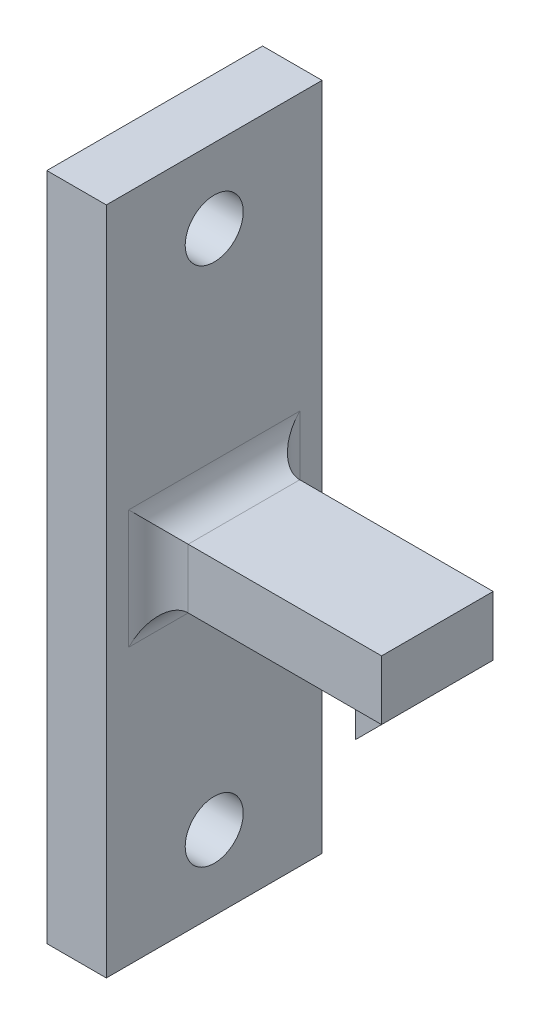
ISO-10303-21;
HEADER;
FILE_DESCRIPTION(('STEP AP214'),'2;1');
FILE_NAME('part.step','',(''),(''),'','','');
FILE_SCHEMA(('AUTOMOTIVE_DESIGN { 1 0 10303 214 1 1 1 1 }'));
ENDSEC;
DATA;
#1=APPLICATION_CONTEXT('core data for automotive mechanical design processes');
#2=APPLICATION_PROTOCOL_DEFINITION('international standard','automotive_design',2000,#1);
#3=PRODUCT_CONTEXT('',#1,'mechanical');
#4=PRODUCT('Part','Part','',(#3));
#5=PRODUCT_RELATED_PRODUCT_CATEGORY('part','',(#4));
#6=PRODUCT_DEFINITION_FORMATION('','',#4);
#7=PRODUCT_DEFINITION_CONTEXT('part definition',#1,'design');
#8=PRODUCT_DEFINITION('design','',#6,#7);
#9=PRODUCT_DEFINITION_SHAPE('','',#8);
#10=(LENGTH_UNIT() NAMED_UNIT(*) SI_UNIT(.MILLI.,.METRE.));
#11=(NAMED_UNIT(*) PLANE_ANGLE_UNIT() SI_UNIT($,.RADIAN.));
#12=(NAMED_UNIT(*) SI_UNIT($,.STERADIAN.) SOLID_ANGLE_UNIT());
#13=UNCERTAINTY_MEASURE_WITH_UNIT(LENGTH_MEASURE(1.E-05),#10,'distance_accuracy_value','');
#14=(GEOMETRIC_REPRESENTATION_CONTEXT(3) GLOBAL_UNCERTAINTY_ASSIGNED_CONTEXT((#13)) GLOBAL_UNIT_ASSIGNED_CONTEXT((#10,
#11,#12)) REPRESENTATION_CONTEXT('',''));
#15=CARTESIAN_POINT('',(0.,0.,0.));
#16=DIRECTION('',(0.,0.,1.));
#17=DIRECTION('',(1.,0.,0.));
#18=AXIS2_PLACEMENT_3D('',#15,#16,#17);
#19=CARTESIAN_POINT('',(0.,-1.99999999999996,-3.49999999999987));
#20=DIRECTION('',(0.,-1.,0.));
#21=DIRECTION('',(1.,0.,0.));
#22=AXIS2_PLACEMENT_3D('',#19,#20,#21);
#23=PLANE('',#22);
#24=DIRECTION('',(1.,0.,0.));
#25=VECTOR('',#24,1.);
#26=CARTESIAN_POINT('',(240.024077489567,-2.,1.25000000000013));
#27=LINE('',#26,#25);
#28=CARTESIAN_POINT('',(227.024077489567,-2.,1.25000000000013));
#29=VERTEX_POINT('',#28);
#30=CARTESIAN_POINT('',(240.024077489567,-2.,1.25000000000013));
#31=VERTEX_POINT('',#30);
#32=EDGE_CURVE('E211',#29,#31,#27,.T.);
#33=ORIENTED_EDGE('',*,*,#32,.F.);
#34=DIRECTION('',(0.,0.,1.));
#35=VECTOR('',#34,1.);
#36=CARTESIAN_POINT('',(227.024077489567,-2.,-6.24999999999987));
#37=LINE('',#36,#35);
#38=CARTESIAN_POINT('',(227.024077489567,-2.,-6.24999999999987));
#39=VERTEX_POINT('',#38);
#40=EDGE_CURVE('E257',#29,#39,#37,.F.);
#41=ORIENTED_EDGE('',*,*,#40,.T.);
#42=DIRECTION('',(-1.,0.,0.));
#43=VECTOR('',#42,1.);
#44=CARTESIAN_POINT('',(240.024077489567,-2.,-6.24999999999987));
#45=LINE('',#44,#43);
#46=CARTESIAN_POINT('',(240.024077489567,-2.,-6.24999999999987));
#47=VERTEX_POINT('',#46);
#48=EDGE_CURVE('E222',#47,#39,#45,.T.);
#49=ORIENTED_EDGE('',*,*,#48,.F.);
#50=DIRECTION('',(0.,0.,1.));
#51=VECTOR('',#50,1.);
#52=CARTESIAN_POINT('',(240.024077489567,-2.,-6.24999999999987));
#53=LINE('',#52,#51);
#54=CARTESIAN_POINT('',(240.024077489567,-2.,-3.99999999999988));
#55=VERTEX_POINT('',#54);
#56=EDGE_CURVE('E228',#47,#55,#53,.T.);
#57=ORIENTED_EDGE('',*,*,#56,.T.);
#58=DIRECTION('',(1.,0.,0.));
#59=VECTOR('',#58,1.);
#60=CARTESIAN_POINT('',(236.024077489567,-2.,-3.99999999999988));
#61=LINE('',#60,#59);
#62=CARTESIAN_POINT('',(236.024077489567,-2.,-3.99999999999988));
#63=VERTEX_POINT('',#62);
#64=EDGE_CURVE('E192',#63,#55,#61,.T.);
#65=ORIENTED_EDGE('',*,*,#64,.F.);
#66=DIRECTION('',(0.,0.,1.));
#67=VECTOR('',#66,1.);
#68=CARTESIAN_POINT('',(236.024077489567,-2.,-3.49999999999987));
#69=LINE('',#68,#67);
#70=CARTESIAN_POINT('',(236.024077489567,-2.,-0.999999999999875));
#71=VERTEX_POINT('',#70);
#72=EDGE_CURVE('E238',#63,#71,#69,.T.);
#73=ORIENTED_EDGE('',*,*,#72,.T.);
#74=DIRECTION('',(-1.,0.,0.));
#75=VECTOR('',#74,1.);
#76=CARTESIAN_POINT('',(240.024077489567,-2.,-0.999999999999875));
#77=LINE('',#76,#75);
#78=CARTESIAN_POINT('',(240.024077489567,-2.,-0.999999999999875));
#79=VERTEX_POINT('',#78);
#80=EDGE_CURVE('E174',#79,#71,#77,.T.);
#81=ORIENTED_EDGE('',*,*,#80,.F.);
#82=DIRECTION('',(0.,0.,-1.));
#83=VECTOR('',#82,1.);
#84=CARTESIAN_POINT('',(240.024077489567,-2.,1.25000000000013));
#85=LINE('',#84,#83);
#86=EDGE_CURVE('E214',#31,#79,#85,.T.);
#87=ORIENTED_EDGE('',*,*,#86,.F.);
#88=EDGE_LOOP('',(#33,#41,#49,#57,#65,#73,#81,#87));
#89=FACE_BOUND('',#88,.T.);
#90=ADVANCED_FACE('F49',(#89),#23,.T.);
#91=CARTESIAN_POINT('',(0.,1.99999999999996,-3.49999999999987));
#92=DIRECTION('',(0.,1.,0.));
#93=DIRECTION('',(-1.,0.,0.));
#94=AXIS2_PLACEMENT_3D('',#91,#92,#93);
#95=PLANE('',#94);
#96=DIRECTION('',(1.,0.,0.));
#97=VECTOR('',#96,1.);
#98=CARTESIAN_POINT('',(240.024077489567,1.99999999999986,-6.24999999999987));
#99=LINE('',#98,#97);
#100=CARTESIAN_POINT('',(227.024077489567,1.99999999999992,-6.24999999999987));
#101=VERTEX_POINT('',#100);
#102=CARTESIAN_POINT('',(240.024077489567,1.99999999999986,-6.24999999999987));
#103=VERTEX_POINT('',#102);
#104=EDGE_CURVE('E225',#101,#103,#99,.T.);
#105=ORIENTED_EDGE('',*,*,#104,.F.);
#106=DIRECTION('',(0.,0.,-1.));
#107=VECTOR('',#106,1.);
#108=CARTESIAN_POINT('',(227.024077489567,2.,1.25000000000013));
#109=LINE('',#108,#107);
#110=CARTESIAN_POINT('',(227.024077489567,2.,1.25000000000013));
#111=VERTEX_POINT('',#110);
#112=EDGE_CURVE('E59',#101,#111,#109,.F.);
#113=ORIENTED_EDGE('',*,*,#112,.T.);
#114=DIRECTION('',(-1.,0.,0.));
#115=VECTOR('',#114,1.);
#116=CARTESIAN_POINT('',(240.024077489567,2.,1.25000000000013));
#117=LINE('',#116,#115);
#118=CARTESIAN_POINT('',(240.024077489567,2.,1.25000000000013));
#119=VERTEX_POINT('',#118);
#120=EDGE_CURVE('E208',#119,#111,#117,.T.);
#121=ORIENTED_EDGE('',*,*,#120,.F.);
#122=DIRECTION('',(0.,0.,1.));
#123=VECTOR('',#122,1.);
#124=CARTESIAN_POINT('',(240.024077489567,2.,-3.49999999999987));
#125=LINE('',#124,#123);
#126=EDGE_CURVE('E241',#103,#119,#125,.T.);
#127=ORIENTED_EDGE('',*,*,#126,.F.);
#128=EDGE_LOOP('',(#105,#113,#121,#127));
#129=FACE_BOUND('',#128,.T.);
#130=ADVANCED_FACE('F333',(#129),#95,.T.);
#131=CARTESIAN_POINT('',(240.024077489567,2.,-3.49999999999987));
#132=DIRECTION('',(1.,0.,0.));
#133=DIRECTION('',(0.,0.,-1.));
#134=AXIS2_PLACEMENT_3D('',#131,#132,#133);
#135=PLANE('',#134);
#136=DIRECTION('',(0.,0.,-1.));
#137=VECTOR('',#136,1.);
#138=CARTESIAN_POINT('',(240.024077489567,-2.,-1.49999999999987));
#139=LINE('',#138,#137);
#140=EDGE_CURVE('E232',#79,#55,#139,.T.);
#141=ORIENTED_EDGE('',*,*,#140,.T.);
#142=ORIENTED_EDGE('',*,*,#56,.F.);
#143=DIRECTION('',(0.,-1.,0.));
#144=VECTOR('',#143,1.);
#145=CARTESIAN_POINT('',(240.024077489567,-2.,-6.24999999999987));
#146=LINE('',#145,#144);
#147=EDGE_CURVE('E218',#103,#47,#146,.T.);
#148=ORIENTED_EDGE('',*,*,#147,.F.);
#149=ORIENTED_EDGE('',*,*,#126,.T.);
#150=DIRECTION('',(0.,1.,0.));
#151=VECTOR('',#150,1.);
#152=CARTESIAN_POINT('',(240.024077489567,2.,1.25000000000013));
#153=LINE('',#152,#151);
#154=EDGE_CURVE('E204',#31,#119,#153,.T.);
#155=ORIENTED_EDGE('',*,*,#154,.F.);
#156=ORIENTED_EDGE('',*,*,#86,.T.);
#157=EDGE_LOOP('',(#141,#142,#148,#149,#155,#156));
#158=FACE_BOUND('',#157,.T.);
#159=ADVANCED_FACE('F340',(#158),#135,.T.);
#160=CARTESIAN_POINT('',(236.024077489567,2.,-1.49999999999987));
#161=DIRECTION('',(1.,0.,0.));
#162=DIRECTION('',(0.,0.,-1.));
#163=AXIS2_PLACEMENT_3D('',#160,#161,#162);
#164=PLANE('',#163);
#165=ORIENTED_EDGE('',*,*,#72,.F.);
#166=DIRECTION('',(0.,1.,0.));
#167=VECTOR('',#166,1.);
#168=CARTESIAN_POINT('',(236.024077489567,-6.,-3.99999999999988));
#169=LINE('',#168,#167);
#170=CARTESIAN_POINT('',(236.024077489567,-6.,-3.99999999999988));
#171=VERTEX_POINT('',#170);
#172=EDGE_CURVE('E200',#171,#63,#169,.T.);
#173=ORIENTED_EDGE('',*,*,#172,.F.);
#174=DIRECTION('',(0.,0.,-1.));
#175=VECTOR('',#174,1.);
#176=CARTESIAN_POINT('',(236.024077489567,-6.,-1.49999999999987));
#177=LINE('',#176,#175);
#178=CARTESIAN_POINT('',(236.024077489567,-6.,-0.999999999999875));
#179=VERTEX_POINT('',#178);
#180=EDGE_CURVE('E235',#179,#171,#177,.T.);
#181=ORIENTED_EDGE('',*,*,#180,.F.);
#182=DIRECTION('',(0.,-1.,0.));
#183=VECTOR('',#182,1.);
#184=CARTESIAN_POINT('',(236.024077489567,-2.,-0.999999999999875));
#185=LINE('',#184,#183);
#186=EDGE_CURVE('E179',#71,#179,#185,.T.);
#187=ORIENTED_EDGE('',*,*,#186,.F.);
#188=EDGE_LOOP('',(#165,#173,#181,#187));
#189=FACE_BOUND('',#188,.T.);
#190=ADVANCED_FACE('F509',(#189),#164,.F.);
#191=CARTESIAN_POINT('',(240.024077489567,-2.,-1.49999999999987));
#192=DIRECTION('',(-0.707106781186547,0.707106781186548,0.));
#193=DIRECTION('',(-0.707106781186548,-0.707106781186547,0.));
#194=AXIS2_PLACEMENT_3D('',#191,#192,#193);
#195=PLANE('',#194);
#196=ORIENTED_EDGE('',*,*,#180,.T.);
#197=DIRECTION('',(-0.707106781186548,-0.707106781186547,0.));
#198=VECTOR('',#197,1.);
#199=CARTESIAN_POINT('',(240.024077489567,-2.,-3.99999999999988));
#200=LINE('',#199,#198);
#201=EDGE_CURVE('E196',#55,#171,#200,.T.);
#202=ORIENTED_EDGE('',*,*,#201,.F.);
#203=ORIENTED_EDGE('',*,*,#140,.F.);
#204=DIRECTION('',(0.707106781186547,0.707106781186548,0.));
#205=VECTOR('',#204,1.);
#206=CARTESIAN_POINT('',(236.024077489567,-6.,-0.999999999999875));
#207=LINE('',#206,#205);
#208=EDGE_CURVE('E188',#179,#79,#207,.T.);
#209=ORIENTED_EDGE('',*,*,#208,.F.);
#210=EDGE_LOOP('',(#196,#202,#203,#209));
#211=FACE_BOUND('',#210,.T.);
#212=ADVANCED_FACE('F499',(#211),#195,.F.);
#213=CARTESIAN_POINT('',(0.,0.,-6.24999999999987));
#214=DIRECTION('',(0.,0.,1.));
#215=DIRECTION('',(1.,0.,0.));
#216=AXIS2_PLACEMENT_3D('',#213,#214,#215);
#217=PLANE('',#216);
#218=ORIENTED_EDGE('',*,*,#48,.T.);
#219=DIRECTION('',(0.,1.,0.));
#220=VECTOR('',#219,1.);
#221=CARTESIAN_POINT('',(227.024077489567,0.,-6.24999999999987));
#222=LINE('',#221,#220);
#223=EDGE_CURVE('E11',#39,#101,#222,.T.);
#224=ORIENTED_EDGE('',*,*,#223,.T.);
#225=ORIENTED_EDGE('',*,*,#104,.T.);
#226=ORIENTED_EDGE('',*,*,#147,.T.);
#227=EDGE_LOOP('',(#218,#224,#225,#226));
#228=FACE_BOUND('',#227,.T.);
#229=ADVANCED_FACE('F489',(#228),#217,.F.);
#230=CARTESIAN_POINT('',(0.,0.,1.25000000000013));
#231=DIRECTION('',(0.,0.,-1.));
#232=DIRECTION('',(-1.,0.,0.));
#233=AXIS2_PLACEMENT_3D('',#230,#231,#232);
#234=PLANE('',#233);
#235=ORIENTED_EDGE('',*,*,#120,.T.);
#236=DIRECTION('',(0.,-1.,0.));
#237=VECTOR('',#236,1.);
#238=CARTESIAN_POINT('',(227.024077489567,0.,1.25000000000013));
#239=LINE('',#238,#237);
#240=EDGE_CURVE('E261',#111,#29,#239,.T.);
#241=ORIENTED_EDGE('',*,*,#240,.T.);
#242=ORIENTED_EDGE('',*,*,#32,.T.);
#243=ORIENTED_EDGE('',*,*,#154,.T.);
#244=EDGE_LOOP('',(#235,#241,#242,#243));
#245=FACE_BOUND('',#244,.T.);
#246=ADVANCED_FACE('F367',(#245),#234,.F.);
#247=CARTESIAN_POINT('',(0.,0.,-3.99999999999988));
#248=DIRECTION('',(0.,0.,1.));
#249=DIRECTION('',(1.,0.,0.));
#250=AXIS2_PLACEMENT_3D('',#247,#248,#249);
#251=PLANE('',#250);
#252=ORIENTED_EDGE('',*,*,#64,.T.);
#253=ORIENTED_EDGE('',*,*,#201,.T.);
#254=ORIENTED_EDGE('',*,*,#172,.T.);
#255=EDGE_LOOP('',(#252,#253,#254));
#256=FACE_BOUND('',#255,.T.);
#257=ADVANCED_FACE('F464',(#256),#251,.F.);
#258=CARTESIAN_POINT('',(0.,0.,-0.999999999999875));
#259=DIRECTION('',(0.,0.,1.));
#260=DIRECTION('',(1.,0.,0.));
#261=AXIS2_PLACEMENT_3D('',#258,#259,#260);
#262=PLANE('',#261);
#263=ORIENTED_EDGE('',*,*,#80,.T.);
#264=ORIENTED_EDGE('',*,*,#186,.T.);
#265=ORIENTED_EDGE('',*,*,#208,.T.);
#266=EDGE_LOOP('',(#263,#264,#265));
#267=FACE_BOUND('',#266,.T.);
#268=ADVANCED_FACE('F456',(#267),#262,.T.);
#269=CARTESIAN_POINT('',(221.024077489567,-22.5,4.75000000000012));
#270=DIRECTION('',(0.,0.,-1.));
#271=DIRECTION('',(-1.,0.,0.));
#272=AXIS2_PLACEMENT_3D('',#269,#270,#271);
#273=PLANE('',#272);
#274=DIRECTION('',(0.,1.,0.));
#275=VECTOR('',#274,1.);
#276=CARTESIAN_POINT('',(225.024077489567,-22.5,4.75000000000012));
#277=LINE('',#276,#275);
#278=CARTESIAN_POINT('',(225.024077489567,-22.5,4.75000000000012));
#279=VERTEX_POINT('',#278);
#280=CARTESIAN_POINT('',(225.024077489567,22.5,4.75000000000012));
#281=VERTEX_POINT('',#280);
#282=EDGE_CURVE('E172',#279,#281,#277,.T.);
#283=ORIENTED_EDGE('',*,*,#282,.T.);
#284=DIRECTION('',(1.,0.,0.));
#285=VECTOR('',#284,1.);
#286=CARTESIAN_POINT('',(221.024077489567,22.5,4.75000000000012));
#287=LINE('',#286,#285);
#288=CARTESIAN_POINT('',(221.024077489567,22.5,4.75000000000012));
#289=VERTEX_POINT('',#288);
#290=EDGE_CURVE('E150',#289,#281,#287,.T.);
#291=ORIENTED_EDGE('',*,*,#290,.F.);
#292=DIRECTION('',(0.,1.,0.));
#293=VECTOR('',#292,1.);
#294=CARTESIAN_POINT('',(221.024077489567,-22.5,4.75000000000012));
#295=LINE('',#294,#293);
#296=CARTESIAN_POINT('',(221.024077489567,-22.5,4.75000000000012));
#297=VERTEX_POINT('',#296);
#298=EDGE_CURVE('E158',#297,#289,#295,.T.);
#299=ORIENTED_EDGE('',*,*,#298,.F.);
#300=DIRECTION('',(1.,0.,0.));
#301=VECTOR('',#300,1.);
#302=CARTESIAN_POINT('',(221.024077489567,-22.5,4.75000000000012));
#303=LINE('',#302,#301);
#304=EDGE_CURVE('E300',#297,#279,#303,.T.);
#305=ORIENTED_EDGE('',*,*,#304,.T.);
#306=EDGE_LOOP('',(#283,#291,#299,#305));
#307=FACE_BOUND('',#306,.T.);
#308=ADVANCED_FACE('F170',(#307),#273,.F.);
#309=CARTESIAN_POINT('',(221.024077489567,22.5,-9.74999999999988));
#310=DIRECTION('',(0.,-1.,0.));
#311=DIRECTION('',(0.,0.,-1.));
#312=AXIS2_PLACEMENT_3D('',#309,#310,#311);
#313=PLANE('',#312);
#314=DIRECTION('',(0.,0.,-1.));
#315=VECTOR('',#314,1.);
#316=CARTESIAN_POINT('',(225.024077489567,22.5,-9.74999999999988));
#317=LINE('',#316,#315);
#318=CARTESIAN_POINT('',(225.024077489567,22.5,-9.74999999999988));
#319=VERTEX_POINT('',#318);
#320=EDGE_CURVE('E303',#281,#319,#317,.T.);
#321=ORIENTED_EDGE('',*,*,#320,.T.);
#322=DIRECTION('',(1.,0.,0.));
#323=VECTOR('',#322,1.);
#324=CARTESIAN_POINT('',(221.024077489567,22.5,-9.74999999999988));
#325=LINE('',#324,#323);
#326=CARTESIAN_POINT('',(221.024077489567,22.5,-9.74999999999988));
#327=VERTEX_POINT('',#326);
#328=EDGE_CURVE('E153',#327,#319,#325,.T.);
#329=ORIENTED_EDGE('',*,*,#328,.F.);
#330=DIRECTION('',(0.,0.,-1.));
#331=VECTOR('',#330,1.);
#332=CARTESIAN_POINT('',(221.024077489567,22.5,-9.74999999999988));
#333=LINE('',#332,#331);
#334=EDGE_CURVE('E146',#289,#327,#333,.T.);
#335=ORIENTED_EDGE('',*,*,#334,.F.);
#336=ORIENTED_EDGE('',*,*,#290,.T.);
#337=EDGE_LOOP('',(#321,#329,#335,#336));
#338=FACE_BOUND('',#337,.T.);
#339=ADVANCED_FACE('F148',(#338),#313,.F.);
#340=CARTESIAN_POINT('',(221.024077489567,-22.5,-9.74999999999988));
#341=DIRECTION('',(0.,0.,1.));
#342=DIRECTION('',(1.,0.,0.));
#343=AXIS2_PLACEMENT_3D('',#340,#341,#342);
#344=PLANE('',#343);
#345=DIRECTION('',(0.,-1.,0.));
#346=VECTOR('',#345,1.);
#347=CARTESIAN_POINT('',(225.024077489567,-22.5,-9.74999999999988));
#348=LINE('',#347,#346);
#349=CARTESIAN_POINT('',(225.024077489567,-22.5,-9.74999999999988));
#350=VERTEX_POINT('',#349);
#351=EDGE_CURVE('E307',#319,#350,#348,.T.);
#352=ORIENTED_EDGE('',*,*,#351,.T.);
#353=DIRECTION('',(1.,0.,0.));
#354=VECTOR('',#353,1.);
#355=CARTESIAN_POINT('',(221.024077489567,-22.5,-9.74999999999988));
#356=LINE('',#355,#354);
#357=CARTESIAN_POINT('',(221.024077489567,-22.5,-9.74999999999988));
#358=VERTEX_POINT('',#357);
#359=EDGE_CURVE('E181',#358,#350,#356,.T.);
#360=ORIENTED_EDGE('',*,*,#359,.F.);
#361=DIRECTION('',(0.,-1.,0.));
#362=VECTOR('',#361,1.);
#363=CARTESIAN_POINT('',(221.024077489567,-22.5,-9.74999999999988));
#364=LINE('',#363,#362);
#365=EDGE_CURVE('E157',#327,#358,#364,.T.);
#366=ORIENTED_EDGE('',*,*,#365,.F.);
#367=ORIENTED_EDGE('',*,*,#328,.T.);
#368=EDGE_LOOP('',(#352,#360,#366,#367));
#369=FACE_BOUND('',#368,.T.);
#370=ADVANCED_FACE('F323',(#369),#344,.F.);
#371=CARTESIAN_POINT('',(221.024077489567,-22.5,-9.74999999999988));
#372=DIRECTION('',(0.,1.,0.));
#373=DIRECTION('',(0.,0.,1.));
#374=AXIS2_PLACEMENT_3D('',#371,#372,#373);
#375=PLANE('',#374);
#376=DIRECTION('',(0.,0.,1.));
#377=VECTOR('',#376,1.);
#378=CARTESIAN_POINT('',(225.024077489567,-22.5,-9.74999999999988));
#379=LINE('',#378,#377);
#380=EDGE_CURVE('E168',#350,#279,#379,.T.);
#381=ORIENTED_EDGE('',*,*,#380,.T.);
#382=ORIENTED_EDGE('',*,*,#304,.F.);
#383=DIRECTION('',(0.,0.,1.));
#384=VECTOR('',#383,1.);
#385=CARTESIAN_POINT('',(221.024077489567,-22.5,-9.74999999999988));
#386=LINE('',#385,#384);
#387=EDGE_CURVE('E163',#358,#297,#386,.T.);
#388=ORIENTED_EDGE('',*,*,#387,.F.);
#389=ORIENTED_EDGE('',*,*,#359,.T.);
#390=EDGE_LOOP('',(#381,#382,#388,#389));
#391=FACE_BOUND('',#390,.T.);
#392=ADVANCED_FACE('F318',(#391),#375,.F.);
#393=CARTESIAN_POINT('',(221.024077489567,0.,0.));
#394=DIRECTION('',(1.,0.,0.));
#395=DIRECTION('',(0.,0.,-1.));
#396=AXIS2_PLACEMENT_3D('',#393,#394,#395);
#397=PLANE('',#396);
#398=CARTESIAN_POINT('',(221.024077489567,17.5,-2.49999999999987));
#399=DIRECTION('',(-1.,0.,0.));
#400=DIRECTION('',(0.,0.,1.));
#401=AXIS2_PLACEMENT_3D('',#398,#399,#400);
#402=CIRCLE('',#401,1.95);
#403=CARTESIAN_POINT('',(221.024077489567,17.5,-0.549999999999875));
#404=VERTEX_POINT('',#403);
#405=EDGE_CURVE('E292',#404,#404,#402,.T.);
#406=ORIENTED_EDGE('',*,*,#405,.F.);
#407=EDGE_LOOP('',(#406));
#408=FACE_BOUND('',#407,.T.);
#409=CARTESIAN_POINT('',(221.024077489567,-17.5,-2.49999999999987));
#410=DIRECTION('',(-1.,0.,0.));
#411=DIRECTION('',(0.,0.,1.));
#412=AXIS2_PLACEMENT_3D('',#409,#410,#411);
#413=CIRCLE('',#412,1.95);
#414=CARTESIAN_POINT('',(221.024077489567,-17.5,-0.549999999999875));
#415=VERTEX_POINT('',#414);
#416=EDGE_CURVE('E286',#415,#415,#413,.T.);
#417=ORIENTED_EDGE('',*,*,#416,.F.);
#418=EDGE_LOOP('',(#417));
#419=FACE_BOUND('',#418,.T.);
#420=ORIENTED_EDGE('',*,*,#298,.T.);
#421=ORIENTED_EDGE('',*,*,#334,.T.);
#422=ORIENTED_EDGE('',*,*,#365,.T.);
#423=ORIENTED_EDGE('',*,*,#387,.T.);
#424=EDGE_LOOP('',(#420,#421,#422,#423));
#425=FACE_BOUND('',#424,.T.);
#426=ADVANCED_FACE('F161',(#408,#419,#425),#397,.F.);
#427=CARTESIAN_POINT('',(225.024077489567,0.,0.));
#428=DIRECTION('',(1.,0.,0.));
#429=DIRECTION('',(0.,0.,-1.));
#430=AXIS2_PLACEMENT_3D('',#427,#428,#429);
#431=PLANE('',#430);
#432=DIRECTION('',(0.,1.,0.));
#433=VECTOR('',#432,1.);
#434=CARTESIAN_POINT('',(225.024077489567,0.,-8.24999999999988));
#435=LINE('',#434,#433);
#436=CARTESIAN_POINT('',(225.024077489567,4.,-8.24999999999988));
#437=VERTEX_POINT('',#436);
#438=CARTESIAN_POINT('',(225.024077489567,-4.,-8.24999999999988));
#439=VERTEX_POINT('',#438);
#440=EDGE_CURVE('E244',#437,#439,#435,.F.);
#441=ORIENTED_EDGE('',*,*,#440,.T.);
#442=DIRECTION('',(0.,0.,1.));
#443=VECTOR('',#442,1.);
#444=CARTESIAN_POINT('',(225.024077489567,-4.,1.25000000000013));
#445=LINE('',#444,#443);
#446=CARTESIAN_POINT('',(225.024077489567,-4.,3.25000000000013));
#447=VERTEX_POINT('',#446);
#448=EDGE_CURVE('E253',#439,#447,#445,.T.);
#449=ORIENTED_EDGE('',*,*,#448,.T.);
#450=DIRECTION('',(0.,-1.,0.));
#451=VECTOR('',#450,1.);
#452=CARTESIAN_POINT('',(225.024077489567,0.,3.25000000000013));
#453=LINE('',#452,#451);
#454=CARTESIAN_POINT('',(225.024077489567,4.,3.25000000000013));
#455=VERTEX_POINT('',#454);
#456=EDGE_CURVE('E250',#447,#455,#453,.F.);
#457=ORIENTED_EDGE('',*,*,#456,.T.);
#458=DIRECTION('',(0.,0.,-1.));
#459=VECTOR('',#458,1.);
#460=CARTESIAN_POINT('',(225.024077489567,4.,-6.24999999999987));
#461=LINE('',#460,#459);
#462=EDGE_CURVE('E247',#455,#437,#461,.T.);
#463=ORIENTED_EDGE('',*,*,#462,.T.);
#464=EDGE_LOOP('',(#441,#449,#457,#463));
#465=FACE_BOUND('',#464,.T.);
#466=CARTESIAN_POINT('',(225.024077489567,17.5,-2.49999999999987));
#467=DIRECTION('',(-1.,0.,0.));
#468=DIRECTION('',(0.,0.,1.));
#469=AXIS2_PLACEMENT_3D('',#466,#467,#468);
#470=CIRCLE('',#469,1.95);
#471=CARTESIAN_POINT('',(225.024077489567,17.5,-0.549999999999875));
#472=VERTEX_POINT('',#471);
#473=EDGE_CURVE('E304',#472,#472,#470,.T.);
#474=ORIENTED_EDGE('',*,*,#473,.T.);
#475=EDGE_LOOP('',(#474));
#476=FACE_BOUND('',#475,.T.);
#477=CARTESIAN_POINT('',(225.024077489567,-17.5,-2.49999999999987));
#478=DIRECTION('',(-1.,0.,0.));
#479=DIRECTION('',(0.,0.,1.));
#480=AXIS2_PLACEMENT_3D('',#477,#478,#479);
#481=CIRCLE('',#480,1.95);
#482=CARTESIAN_POINT('',(225.024077489567,-17.5,-0.549999999999875));
#483=VERTEX_POINT('',#482);
#484=EDGE_CURVE('E280',#483,#483,#481,.T.);
#485=ORIENTED_EDGE('',*,*,#484,.T.);
#486=EDGE_LOOP('',(#485));
#487=FACE_BOUND('',#486,.T.);
#488=ORIENTED_EDGE('',*,*,#282,.F.);
#489=ORIENTED_EDGE('',*,*,#380,.F.);
#490=ORIENTED_EDGE('',*,*,#351,.F.);
#491=ORIENTED_EDGE('',*,*,#320,.F.);
#492=EDGE_LOOP('',(#488,#489,#490,#491));
#493=FACE_BOUND('',#492,.T.);
#494=ADVANCED_FACE('F322',(#465,#476,#487,#493),#431,.T.);
#495=CARTESIAN_POINT('',(225.024077489567,-17.5,-2.49999999999987));
#496=DIRECTION('',(-1.,0.,0.));
#497=DIRECTION('',(0.,0.,1.));
#498=AXIS2_PLACEMENT_3D('',#495,#496,#497);
#499=CYLINDRICAL_SURFACE('',#498,1.95);
#500=ORIENTED_EDGE('',*,*,#484,.F.);
#501=EDGE_LOOP('',(#500));
#502=FACE_BOUND('',#501,.T.);
#503=ORIENTED_EDGE('',*,*,#416,.T.);
#504=EDGE_LOOP('',(#503));
#505=FACE_BOUND('',#504,.T.);
#506=ADVANCED_FACE('F361',(#502,#505),#499,.F.);
#507=CARTESIAN_POINT('',(225.024077489567,17.5,-2.49999999999987));
#508=DIRECTION('',(-1.,0.,0.));
#509=DIRECTION('',(0.,0.,1.));
#510=AXIS2_PLACEMENT_3D('',#507,#508,#509);
#511=CYLINDRICAL_SURFACE('',#510,1.95);
#512=ORIENTED_EDGE('',*,*,#473,.F.);
#513=EDGE_LOOP('',(#512));
#514=FACE_BOUND('',#513,.T.);
#515=ORIENTED_EDGE('',*,*,#405,.T.);
#516=EDGE_LOOP('',(#515));
#517=FACE_BOUND('',#516,.T.);
#518=ADVANCED_FACE('F356',(#514,#517),#511,.F.);
#519=CARTESIAN_POINT('',(227.024077489567,4.,0.));
#520=DIRECTION('',(0.,0.,1.));
#521=DIRECTION('',(1.,0.,0.));
#522=AXIS2_PLACEMENT_3D('',#519,#520,#521);
#523=CYLINDRICAL_SURFACE('',#522,2.);
#524=CARTESIAN_POINT('',(227.024077489567,4.,3.25000000000013));
#525=DIRECTION('',(0.,-0.707106781186547,0.707106781186547));
#526=DIRECTION('',(0.,0.707106781186547,0.707106781186547));
#527=AXIS2_PLACEMENT_3D('',#524,#525,#526);
#528=ELLIPSE('',#527,2.82842712474619,2.);
#529=EDGE_CURVE('E271',#111,#455,#528,.F.);
#530=ORIENTED_EDGE('',*,*,#529,.F.);
#531=ORIENTED_EDGE('',*,*,#112,.F.);
#532=CARTESIAN_POINT('',(227.024077489567,4.,-8.24999999999988));
#533=DIRECTION('',(0.,0.707106781186547,0.707106781186547));
#534=DIRECTION('',(0.,0.707106781186547,-0.707106781186547));
#535=AXIS2_PLACEMENT_3D('',#532,#533,#534);
#536=ELLIPSE('',#535,2.82842712474619,2.);
#537=EDGE_CURVE('E53',#437,#101,#536,.T.);
#538=ORIENTED_EDGE('',*,*,#537,.F.);
#539=ORIENTED_EDGE('',*,*,#462,.F.);
#540=EDGE_LOOP('',(#530,#531,#538,#539));
#541=FACE_BOUND('',#540,.T.);
#542=ADVANCED_FACE('F51',(#541),#523,.F.);
#543=CARTESIAN_POINT('',(227.024077489567,0.,-8.24999999999988));
#544=DIRECTION('',(0.,1.,0.));
#545=DIRECTION('',(0.,0.,1.));
#546=AXIS2_PLACEMENT_3D('',#543,#544,#545);
#547=CYLINDRICAL_SURFACE('',#546,2.);
#548=ORIENTED_EDGE('',*,*,#537,.T.);
#549=ORIENTED_EDGE('',*,*,#223,.F.);
#550=CARTESIAN_POINT('',(227.024077489567,-4.,-8.24999999999988));
#551=DIRECTION('',(0.,0.707106781186547,-0.707106781186547));
#552=DIRECTION('',(0.,0.707106781186547,0.707106781186547));
#553=AXIS2_PLACEMENT_3D('',#550,#551,#552);
#554=ELLIPSE('',#553,2.82842712474619,2.);
#555=EDGE_CURVE('E269',#439,#39,#554,.T.);
#556=ORIENTED_EDGE('',*,*,#555,.F.);
#557=ORIENTED_EDGE('',*,*,#440,.F.);
#558=EDGE_LOOP('',(#548,#549,#556,#557));
#559=FACE_BOUND('',#558,.T.);
#560=ADVANCED_FACE('F351',(#559),#547,.F.);
#561=CARTESIAN_POINT('',(227.024077489567,0.,3.25000000000013));
#562=DIRECTION('',(0.,-1.,0.));
#563=DIRECTION('',(0.,0.,-1.));
#564=AXIS2_PLACEMENT_3D('',#561,#562,#563);
#565=CYLINDRICAL_SURFACE('',#564,2.);
#566=ORIENTED_EDGE('',*,*,#529,.T.);
#567=ORIENTED_EDGE('',*,*,#456,.F.);
#568=CARTESIAN_POINT('',(227.024077489567,-4.,3.25000000000013));
#569=DIRECTION('',(0.,-0.707106781186547,-0.707106781186547));
#570=DIRECTION('',(0.,-0.707106781186547,0.707106781186547));
#571=AXIS2_PLACEMENT_3D('',#568,#569,#570);
#572=ELLIPSE('',#571,2.82842712474619,2.);
#573=EDGE_CURVE('E266',#29,#447,#572,.F.);
#574=ORIENTED_EDGE('',*,*,#573,.F.);
#575=ORIENTED_EDGE('',*,*,#240,.F.);
#576=EDGE_LOOP('',(#566,#567,#574,#575));
#577=FACE_BOUND('',#576,.T.);
#578=ADVANCED_FACE('F348',(#577),#565,.F.);
#579=CARTESIAN_POINT('',(227.024077489567,-4.,0.));
#580=DIRECTION('',(0.,0.,-1.));
#581=DIRECTION('',(-1.,0.,0.));
#582=AXIS2_PLACEMENT_3D('',#579,#580,#581);
#583=CYLINDRICAL_SURFACE('',#582,2.);
#584=ORIENTED_EDGE('',*,*,#555,.T.);
#585=ORIENTED_EDGE('',*,*,#40,.F.);
#586=ORIENTED_EDGE('',*,*,#573,.T.);
#587=ORIENTED_EDGE('',*,*,#448,.F.);
#588=EDGE_LOOP('',(#584,#585,#586,#587));
#589=FACE_BOUND('',#588,.T.);
#590=ADVANCED_FACE('F345',(#589),#583,.F.);
#591=CLOSED_SHELL('',(#90,#130,#159,#190,#212,#229,#246,#257,#268,#308,#339,#370,#392,#426,#494,
#506,#518,#542,#560,#578,#590));
#592=MANIFOLD_SOLID_BREP('B2',#591);
#593=ADVANCED_BREP_SHAPE_REPRESENTATION('',(#18,#592),#14);
#594=SHAPE_DEFINITION_REPRESENTATION(#9,#593);
ENDSEC;
END-ISO-10303-21;
